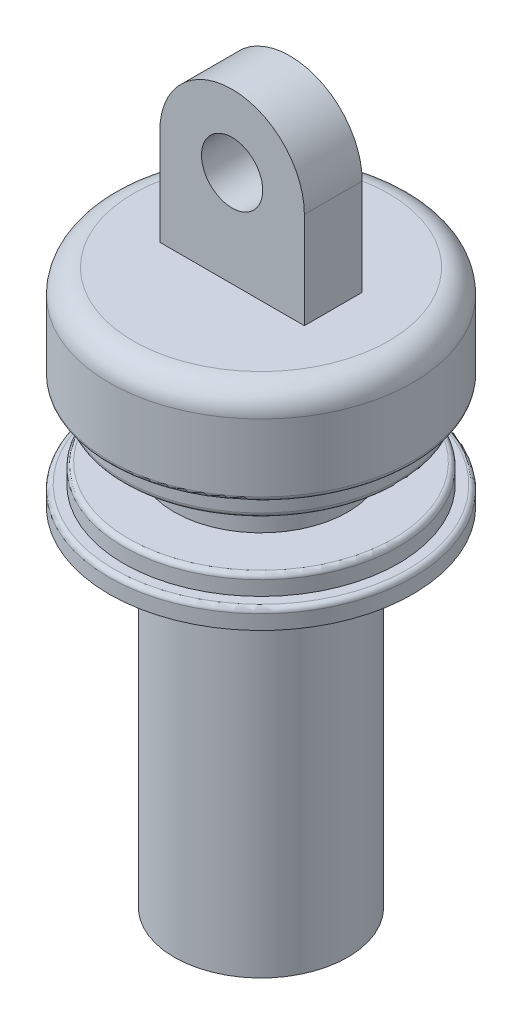
ISO-10303-21;
HEADER;
FILE_DESCRIPTION(('STEP AP214'),'2;1');
FILE_NAME('part.step','',(''),(''),'','','');
FILE_SCHEMA(('AUTOMOTIVE_DESIGN { 1 0 10303 214 1 1 1 1 }'));
ENDSEC;
DATA;
#1=APPLICATION_CONTEXT('core data for automotive mechanical design processes');
#2=APPLICATION_PROTOCOL_DEFINITION('international standard','automotive_design',2000,#1);
#3=PRODUCT_CONTEXT('',#1,'mechanical');
#4=PRODUCT('Part','Part','',(#3));
#5=PRODUCT_RELATED_PRODUCT_CATEGORY('part','',(#4));
#6=PRODUCT_DEFINITION_FORMATION('','',#4);
#7=PRODUCT_DEFINITION_CONTEXT('part definition',#1,'design');
#8=PRODUCT_DEFINITION('design','',#6,#7);
#9=PRODUCT_DEFINITION_SHAPE('','',#8);
#10=(LENGTH_UNIT() NAMED_UNIT(*) SI_UNIT(.MILLI.,.METRE.));
#11=(NAMED_UNIT(*) PLANE_ANGLE_UNIT() SI_UNIT($,.RADIAN.));
#12=(NAMED_UNIT(*) SI_UNIT($,.STERADIAN.) SOLID_ANGLE_UNIT());
#13=UNCERTAINTY_MEASURE_WITH_UNIT(LENGTH_MEASURE(1.E-05),#10,'distance_accuracy_value','');
#14=(GEOMETRIC_REPRESENTATION_CONTEXT(3) GLOBAL_UNCERTAINTY_ASSIGNED_CONTEXT((#13)) GLOBAL_UNIT_ASSIGNED_CONTEXT((#10,
#11,#12)) REPRESENTATION_CONTEXT('',''));
#15=CARTESIAN_POINT('',(0.,0.,0.));
#16=DIRECTION('',(0.,0.,1.));
#17=DIRECTION('',(1.,0.,0.));
#18=AXIS2_PLACEMENT_3D('',#15,#16,#17);
#19=CARTESIAN_POINT('',(0.,-135.,0.));
#20=DIRECTION('',(0.,1.,0.));
#21=DIRECTION('',(0.,0.,1.));
#22=AXIS2_PLACEMENT_3D('',#19,#20,#21);
#23=CYLINDRICAL_SURFACE('',#22,18.);
#24=CARTESIAN_POINT('',(0.,-55.,0.));
#25=DIRECTION('',(0.,1.,0.));
#26=DIRECTION('',(0.,0.,1.));
#27=AXIS2_PLACEMENT_3D('',#24,#25,#26);
#28=CIRCLE('',#27,18.);
#29=CARTESIAN_POINT('',(0.,-55.,18.));
#30=VERTEX_POINT('',#29);
#31=EDGE_CURVE('E467',#30,#30,#28,.T.);
#32=CARTESIAN_POINT('',(0.,-45.,0.));
#33=DIRECTION('',(0.,-1.,0.));
#34=DIRECTION('',(0.,0.,-1.));
#35=AXIS2_PLACEMENT_3D('',#32,#33,#34);
#36=CIRCLE('',#35,18.);
#37=CARTESIAN_POINT('',(0.,-45.,18.));
#38=VERTEX_POINT('',#37);
#39=EDGE_CURVE('E189',#38,#38,#36,.T.);
#40=CARTESIAN_POINT('',(0.,-55.,18.));
#41=CARTESIAN_POINT('',(0.,-54.8958333333333,18.));
#42=CARTESIAN_POINT('',(0.,-54.7916666666667,18.));
#43=CARTESIAN_POINT('',(0.,-54.5833333333333,18.));
#44=CARTESIAN_POINT('',(0.,-54.4791666666667,18.));
#45=CARTESIAN_POINT('',(0.,-54.2708333333333,18.));
#46=CARTESIAN_POINT('',(0.,-54.1666666666667,18.));
#47=CARTESIAN_POINT('',(0.,-53.9583333333333,18.));
#48=CARTESIAN_POINT('',(0.,-53.8541666666667,18.));
#49=CARTESIAN_POINT('',(0.,-53.6458333333333,18.));
#50=CARTESIAN_POINT('',(0.,-53.5416666666667,18.));
#51=CARTESIAN_POINT('',(0.,-53.3333333333333,18.));
#52=CARTESIAN_POINT('',(0.,-53.2291666666667,18.));
#53=CARTESIAN_POINT('',(0.,-53.0208333333333,18.));
#54=CARTESIAN_POINT('',(0.,-52.9166666666667,18.));
#55=CARTESIAN_POINT('',(0.,-52.7083333333333,18.));
#56=CARTESIAN_POINT('',(0.,-52.6041666666667,18.));
#57=CARTESIAN_POINT('',(0.,-52.3958333333333,18.));
#58=CARTESIAN_POINT('',(0.,-52.2916666666667,18.));
#59=CARTESIAN_POINT('',(0.,-52.0833333333333,18.));
#60=CARTESIAN_POINT('',(0.,-51.9791666666667,18.));
#61=CARTESIAN_POINT('',(0.,-51.7708333333333,18.));
#62=CARTESIAN_POINT('',(0.,-51.6666666666667,18.));
#63=CARTESIAN_POINT('',(0.,-51.4583333333333,18.));
#64=CARTESIAN_POINT('',(0.,-51.3541666666667,18.));
#65=CARTESIAN_POINT('',(0.,-51.1458333333333,18.));
#66=CARTESIAN_POINT('',(0.,-51.0416666666667,18.));
#67=CARTESIAN_POINT('',(0.,-50.8333333333333,18.));
#68=CARTESIAN_POINT('',(0.,-50.7291666666667,18.));
#69=CARTESIAN_POINT('',(0.,-50.5208333333333,18.));
#70=CARTESIAN_POINT('',(0.,-50.4166666666667,18.));
#71=CARTESIAN_POINT('',(0.,-50.2083333333333,18.));
#72=CARTESIAN_POINT('',(0.,-50.1041666666667,18.));
#73=CARTESIAN_POINT('',(0.,-49.8958333333333,18.));
#74=CARTESIAN_POINT('',(0.,-49.7916666666667,18.));
#75=CARTESIAN_POINT('',(0.,-49.5833333333333,18.));
#76=CARTESIAN_POINT('',(0.,-49.4791666666667,18.));
#77=CARTESIAN_POINT('',(0.,-49.2708333333333,18.));
#78=CARTESIAN_POINT('',(0.,-49.1666666666667,18.));
#79=CARTESIAN_POINT('',(0.,-48.9583333333333,18.));
#80=CARTESIAN_POINT('',(0.,-48.8541666666667,18.));
#81=CARTESIAN_POINT('',(0.,-48.6458333333333,18.));
#82=CARTESIAN_POINT('',(0.,-48.5416666666667,18.));
#83=CARTESIAN_POINT('',(0.,-48.3333333333333,18.));
#84=CARTESIAN_POINT('',(0.,-48.2291666666667,18.));
#85=CARTESIAN_POINT('',(0.,-48.0208333333333,18.));
#86=CARTESIAN_POINT('',(0.,-47.9166666666667,18.));
#87=CARTESIAN_POINT('',(0.,-47.7083333333333,18.));
#88=CARTESIAN_POINT('',(0.,-47.6041666666667,18.));
#89=CARTESIAN_POINT('',(0.,-47.3958333333333,18.));
#90=CARTESIAN_POINT('',(0.,-47.2916666666667,18.));
#91=CARTESIAN_POINT('',(0.,-47.0833333333333,18.));
#92=CARTESIAN_POINT('',(0.,-46.9791666666667,18.));
#93=CARTESIAN_POINT('',(0.,-46.7708333333333,18.));
#94=CARTESIAN_POINT('',(0.,-46.6666666666667,18.));
#95=CARTESIAN_POINT('',(0.,-46.4583333333333,18.));
#96=CARTESIAN_POINT('',(0.,-46.3541666666667,18.));
#97=CARTESIAN_POINT('',(0.,-46.1458333333333,18.));
#98=CARTESIAN_POINT('',(0.,-46.0416666666667,18.));
#99=CARTESIAN_POINT('',(0.,-45.8333333333333,18.));
#100=CARTESIAN_POINT('',(0.,-45.7291666666667,18.));
#101=CARTESIAN_POINT('',(0.,-45.5208333333333,18.));
#102=CARTESIAN_POINT('',(0.,-45.4166666666667,18.));
#103=CARTESIAN_POINT('',(0.,-45.2083333333333,18.));
#104=CARTESIAN_POINT('',(0.,-45.1041666666667,18.));
#105=CARTESIAN_POINT('',(0.,-45.,18.));
#106=B_SPLINE_CURVE_WITH_KNOTS('',3,(#40,#41,#42,#43,#44,#45,#46,#47,#48,#49,#50,#51,#52,#53,
#54,#55,#56,#57,#58,#59,#60,#61,#62,#63,#64,#65,#66,#67,#68,#69,#70,#71,#72,#73,#74,#75,#76,#77,
#78,#79,#80,#81,#82,#83,#84,#85,#86,#87,#88,#89,#90,#91,#92,#93,#94,#95,#96,#97,#98,#99,#100,
#101,#102,#103,#104,#105),.UNSPECIFIED.,.F.,.F.,(4,2,2,2,2,2,2,2,2,2,2,2,2,2,2,2,2,2,2,2,2,2,2,
2,2,2,2,2,2,2,2,2,4),(0.,0.312499999999993,0.625000000000001,0.937500000000008,1.25,
1.56249999999999,1.875,2.18750000000001,2.5,2.8125,3.125,3.43750000000001,3.75,4.0625,4.375,
4.68750000000001,5.,5.3125,5.62500000000001,5.93750000000001,6.25000000000001,6.5625,
6.87500000000001,7.18750000000001,7.50000000000001,7.8125,8.12500000000001,8.43750000000001,
8.75000000000001,9.0625,9.37500000000001,9.68750000000002,10.),.UNSPECIFIED.);
#107=EDGE_CURVE('BSEAM37',#30,#38,#106,.T.);
#108=ORIENTED_EDGE('',*,*,#31,.T.);
#109=ORIENTED_EDGE('',*,*,#39,.T.);
#110=ORIENTED_EDGE('',*,*,#107,.T.);
#111=ORIENTED_EDGE('',*,*,#107,.F.);
#112=EDGE_LOOP('',(#108,#110,#109,#111));
#113=FACE_BOUND('',#112,.T.);
#114=ADVANCED_FACE('F37',(#113),#23,.T.);
#115=CARTESIAN_POINT('',(0.,-45.,0.));
#116=DIRECTION('',(0.,-1.,0.));
#117=DIRECTION('',(0.,0.,-1.));
#118=AXIS2_PLACEMENT_3D('',#115,#116,#117);
#119=PLANE('',#118);
#120=CARTESIAN_POINT('',(0.,-45.,0.));
#121=DIRECTION('',(0.,-1.,0.));
#122=DIRECTION('',(0.,0.,-1.));
#123=AXIS2_PLACEMENT_3D('',#120,#121,#122);
#124=CIRCLE('',#123,27.5);
#125=CARTESIAN_POINT('',(0.,-45.,-27.5));
#126=VERTEX_POINT('',#125);
#127=EDGE_CURVE('E119',#126,#126,#124,.T.);
#128=ORIENTED_EDGE('',*,*,#127,.T.);
#129=EDGE_LOOP('',(#128));
#130=FACE_BOUND('',#129,.T.);
#131=ORIENTED_EDGE('',*,*,#39,.F.);
#132=EDGE_LOOP('',(#131));
#133=FACE_BOUND('',#132,.T.);
#134=ADVANCED_FACE('F160',(#130,#133),#119,.T.);
#135=CARTESIAN_POINT('',(0.,-40.,0.));
#136=DIRECTION('',(0.,-1.,0.));
#137=DIRECTION('',(0.,0.,-1.));
#138=AXIS2_PLACEMENT_3D('',#135,#136,#137);
#139=PLANE('',#138);
#140=CARTESIAN_POINT('',(0.,-40.,0.));
#141=DIRECTION('',(0.,-1.,0.));
#142=DIRECTION('',(0.,0.,-1.));
#143=AXIS2_PLACEMENT_3D('',#140,#141,#142);
#144=CIRCLE('',#143,29.5);
#145=CARTESIAN_POINT('',(0.,-40.,-29.5));
#146=VERTEX_POINT('',#145);
#147=EDGE_CURVE('E47',#146,#146,#144,.F.);
#148=ORIENTED_EDGE('',*,*,#147,.T.);
#149=EDGE_LOOP('',(#148));
#150=FACE_BOUND('',#149,.T.);
#151=CARTESIAN_POINT('',(0.,-40.,0.));
#152=DIRECTION('',(0.,-1.,0.));
#153=DIRECTION('',(0.,0.,-1.));
#154=AXIS2_PLACEMENT_3D('',#151,#152,#153);
#155=CIRCLE('',#154,30.5);
#156=CARTESIAN_POINT('',(0.,-40.,-30.5));
#157=VERTEX_POINT('',#156);
#158=EDGE_CURVE('E128',#157,#157,#155,.T.);
#159=ORIENTED_EDGE('',*,*,#158,.T.);
#160=EDGE_LOOP('',(#159));
#161=FACE_BOUND('',#160,.T.);
#162=ADVANCED_FACE('F134',(#150,#161),#139,.T.);
#163=CARTESIAN_POINT('',(-15.,-20.,6.));
#164=DIRECTION('',(1.,0.,0.));
#165=DIRECTION('',(0.,0.,-1.));
#166=AXIS2_PLACEMENT_3D('',#163,#164,#165);
#167=PLANE('',#166);
#168=DIRECTION('',(0.,-1.,0.));
#169=VECTOR('',#168,1.);
#170=CARTESIAN_POINT('',(-15.,-20.,-6.));
#171=LINE('',#170,#169);
#172=CARTESIAN_POINT('',(-15.,0.,-6.));
#173=VERTEX_POINT('',#172);
#174=CARTESIAN_POINT('',(-15.,-20.,-6.));
#175=VERTEX_POINT('',#174);
#176=EDGE_CURVE('E103',#173,#175,#171,.T.);
#177=ORIENTED_EDGE('',*,*,#176,.T.);
#178=DIRECTION('',(0.,0.,-1.));
#179=VECTOR('',#178,1.);
#180=CARTESIAN_POINT('',(-15.,-20.,6.));
#181=LINE('',#180,#179);
#182=CARTESIAN_POINT('',(-15.,-20.,6.));
#183=VERTEX_POINT('',#182);
#184=EDGE_CURVE('E98',#183,#175,#181,.T.);
#185=ORIENTED_EDGE('',*,*,#184,.F.);
#186=DIRECTION('',(0.,-1.,0.));
#187=VECTOR('',#186,1.);
#188=CARTESIAN_POINT('',(-15.,-20.,6.));
#189=LINE('',#188,#187);
#190=CARTESIAN_POINT('',(-15.,0.,6.));
#191=VERTEX_POINT('',#190);
#192=EDGE_CURVE('E81',#191,#183,#189,.T.);
#193=ORIENTED_EDGE('',*,*,#192,.F.);
#194=DIRECTION('',(0.,0.,-1.));
#195=VECTOR('',#194,1.);
#196=CARTESIAN_POINT('',(-15.,0.,6.));
#197=LINE('',#196,#195);
#198=EDGE_CURVE('E109',#191,#173,#197,.T.);
#199=ORIENTED_EDGE('',*,*,#198,.T.);
#200=EDGE_LOOP('',(#177,#185,#193,#199));
#201=FACE_BOUND('',#200,.T.);
#202=ADVANCED_FACE('F205',(#201),#167,.F.);
#203=CARTESIAN_POINT('',(15.,-20.,6.));
#204=DIRECTION('',(-1.,0.,0.));
#205=DIRECTION('',(0.,0.,1.));
#206=AXIS2_PLACEMENT_3D('',#203,#204,#205);
#207=PLANE('',#206);
#208=DIRECTION('',(0.,1.,0.));
#209=VECTOR('',#208,1.);
#210=CARTESIAN_POINT('',(15.,-20.,-6.));
#211=LINE('',#210,#209);
#212=CARTESIAN_POINT('',(15.,-20.,-6.));
#213=VERTEX_POINT('',#212);
#214=CARTESIAN_POINT('',(15.,0.,-6.));
#215=VERTEX_POINT('',#214);
#216=EDGE_CURVE('E70',#213,#215,#211,.T.);
#217=ORIENTED_EDGE('',*,*,#216,.T.);
#218=DIRECTION('',(0.,0.,-1.));
#219=VECTOR('',#218,1.);
#220=CARTESIAN_POINT('',(15.,0.,6.));
#221=LINE('',#220,#219);
#222=CARTESIAN_POINT('',(15.,0.,6.));
#223=VERTEX_POINT('',#222);
#224=EDGE_CURVE('E99',#223,#215,#221,.T.);
#225=ORIENTED_EDGE('',*,*,#224,.F.);
#226=DIRECTION('',(0.,1.,0.));
#227=VECTOR('',#226,1.);
#228=CARTESIAN_POINT('',(15.,-20.,6.));
#229=LINE('',#228,#227);
#230=CARTESIAN_POINT('',(15.,-20.,6.));
#231=VERTEX_POINT('',#230);
#232=EDGE_CURVE('E95',#231,#223,#229,.T.);
#233=ORIENTED_EDGE('',*,*,#232,.F.);
#234=DIRECTION('',(0.,0.,-1.));
#235=VECTOR('',#234,1.);
#236=CARTESIAN_POINT('',(15.,-20.,6.));
#237=LINE('',#236,#235);
#238=EDGE_CURVE('E93',#231,#213,#237,.T.);
#239=ORIENTED_EDGE('',*,*,#238,.T.);
#240=EDGE_LOOP('',(#217,#225,#233,#239));
#241=FACE_BOUND('',#240,.T.);
#242=ADVANCED_FACE('F94',(#241),#207,.F.);
#243=CARTESIAN_POINT('',(0.,0.,6.));
#244=DIRECTION('',(0.,0.,-1.));
#245=DIRECTION('',(-1.,0.,0.));
#246=AXIS2_PLACEMENT_3D('',#243,#244,#245);
#247=CYLINDRICAL_SURFACE('',#246,15.);
#248=CARTESIAN_POINT('',(0.,0.,-6.));
#249=DIRECTION('',(0.,0.,1.));
#250=DIRECTION('',(-1.,0.,0.));
#251=AXIS2_PLACEMENT_3D('',#248,#249,#250);
#252=CIRCLE('',#251,15.);
#253=EDGE_CURVE('E76',#215,#173,#252,.T.);
#254=ORIENTED_EDGE('',*,*,#253,.T.);
#255=ORIENTED_EDGE('',*,*,#198,.F.);
#256=CARTESIAN_POINT('',(0.,0.,6.));
#257=DIRECTION('',(0.,0.,1.));
#258=DIRECTION('',(-1.,0.,0.));
#259=AXIS2_PLACEMENT_3D('',#256,#257,#258);
#260=CIRCLE('',#259,15.);
#261=EDGE_CURVE('E55',#223,#191,#260,.T.);
#262=ORIENTED_EDGE('',*,*,#261,.F.);
#263=ORIENTED_EDGE('',*,*,#224,.T.);
#264=EDGE_LOOP('',(#254,#255,#262,#263));
#265=FACE_BOUND('',#264,.T.);
#266=ADVANCED_FACE('F203',(#265),#247,.T.);
#267=CARTESIAN_POINT('',(0.,0.,6.));
#268=DIRECTION('',(0.,0.,-1.));
#269=DIRECTION('',(-1.,0.,0.));
#270=AXIS2_PLACEMENT_3D('',#267,#268,#269);
#271=PLANE('',#270);
#272=CARTESIAN_POINT('',(0.,0.,6.));
#273=DIRECTION('',(0.,0.,1.));
#274=DIRECTION('',(1.,0.,0.));
#275=AXIS2_PLACEMENT_3D('',#272,#273,#274);
#276=CIRCLE('',#275,6.35);
#277=CARTESIAN_POINT('',(6.35,0.,6.));
#278=VERTEX_POINT('',#277);
#279=EDGE_CURVE('E188',#278,#278,#276,.T.);
#280=ORIENTED_EDGE('',*,*,#279,.F.);
#281=EDGE_LOOP('',(#280));
#282=FACE_BOUND('',#281,.T.);
#283=ORIENTED_EDGE('',*,*,#192,.T.);
#284=DIRECTION('',(1.,0.,0.));
#285=VECTOR('',#284,1.);
#286=CARTESIAN_POINT('',(-15.,-20.,6.));
#287=LINE('',#286,#285);
#288=EDGE_CURVE('E200',#183,#231,#287,.T.);
#289=ORIENTED_EDGE('',*,*,#288,.T.);
#290=ORIENTED_EDGE('',*,*,#232,.T.);
#291=ORIENTED_EDGE('',*,*,#261,.T.);
#292=EDGE_LOOP('',(#283,#289,#290,#291));
#293=FACE_BOUND('',#292,.T.);
#294=ADVANCED_FACE('F202',(#282,#293),#271,.F.);
#295=CARTESIAN_POINT('',(0.,0.,-6.));
#296=DIRECTION('',(0.,0.,-1.));
#297=DIRECTION('',(-1.,0.,0.));
#298=AXIS2_PLACEMENT_3D('',#295,#296,#297);
#299=PLANE('',#298);
#300=CARTESIAN_POINT('',(0.,0.,-6.));
#301=DIRECTION('',(0.,0.,-1.));
#302=DIRECTION('',(-1.,0.,0.));
#303=AXIS2_PLACEMENT_3D('',#300,#301,#302);
#304=CIRCLE('',#303,6.35);
#305=CARTESIAN_POINT('',(-6.35,0.,-6.));
#306=VERTEX_POINT('',#305);
#307=EDGE_CURVE('E41',#306,#306,#304,.T.);
#308=ORIENTED_EDGE('',*,*,#307,.F.);
#309=EDGE_LOOP('',(#308));
#310=FACE_BOUND('',#309,.T.);
#311=ORIENTED_EDGE('',*,*,#176,.F.);
#312=ORIENTED_EDGE('',*,*,#253,.F.);
#313=ORIENTED_EDGE('',*,*,#216,.F.);
#314=DIRECTION('',(1.,0.,0.));
#315=VECTOR('',#314,1.);
#316=CARTESIAN_POINT('',(-15.,-20.,-6.));
#317=LINE('',#316,#315);
#318=EDGE_CURVE('E88',#175,#213,#317,.T.);
#319=ORIENTED_EDGE('',*,*,#318,.F.);
#320=EDGE_LOOP('',(#311,#312,#313,#319));
#321=FACE_BOUND('',#320,.T.);
#322=ADVANCED_FACE('F86',(#310,#321),#299,.T.);
#323=CARTESIAN_POINT('',(0.,-20.,0.));
#324=DIRECTION('',(0.,-1.,0.));
#325=DIRECTION('',(0.,0.,-1.));
#326=AXIS2_PLACEMENT_3D('',#323,#324,#325);
#327=PLANE('',#326);
#328=CARTESIAN_POINT('',(0.,-20.,0.));
#329=DIRECTION('',(0.,-1.,0.));
#330=DIRECTION('',(0.,0.,-1.));
#331=AXIS2_PLACEMENT_3D('',#328,#329,#330);
#332=CIRCLE('',#331,26.5);
#333=CARTESIAN_POINT('',(0.,-20.,-26.5));
#334=VERTEX_POINT('',#333);
#335=EDGE_CURVE('E116',#334,#334,#332,.F.);
#336=ORIENTED_EDGE('',*,*,#335,.T.);
#337=EDGE_LOOP('',(#336));
#338=FACE_BOUND('',#337,.T.);
#339=ORIENTED_EDGE('',*,*,#238,.F.);
#340=ORIENTED_EDGE('',*,*,#288,.F.);
#341=ORIENTED_EDGE('',*,*,#184,.T.);
#342=ORIENTED_EDGE('',*,*,#318,.T.);
#343=EDGE_LOOP('',(#339,#340,#341,#342));
#344=FACE_BOUND('',#343,.T.);
#345=ADVANCED_FACE('F102',(#338,#344),#327,.F.);
#346=CARTESIAN_POINT('',(0.,-40.,0.));
#347=DIRECTION('',(0.,1.,0.));
#348=DIRECTION('',(0.,0.,1.));
#349=AXIS2_PLACEMENT_3D('',#346,#347,#348);
#350=CYLINDRICAL_SURFACE('',#349,31.5);
#351=CARTESIAN_POINT('',(0.,-39.,0.));
#352=DIRECTION('',(0.,-1.,0.));
#353=DIRECTION('',(0.,0.,-1.));
#354=AXIS2_PLACEMENT_3D('',#351,#352,#353);
#355=CIRCLE('',#354,31.5);
#356=CARTESIAN_POINT('',(0.,-39.,-31.5));
#357=VERTEX_POINT('',#356);
#358=EDGE_CURVE('E11',#357,#357,#355,.F.);
#359=ORIENTED_EDGE('',*,*,#358,.T.);
#360=EDGE_LOOP('',(#359));
#361=FACE_BOUND('',#360,.T.);
#362=CARTESIAN_POINT('',(0.,-25.,0.));
#363=DIRECTION('',(0.,-1.,0.));
#364=DIRECTION('',(0.,0.,-1.));
#365=AXIS2_PLACEMENT_3D('',#362,#363,#364);
#366=CIRCLE('',#365,31.5);
#367=CARTESIAN_POINT('',(0.,-25.,-31.5));
#368=VERTEX_POINT('',#367);
#369=EDGE_CURVE('E113',#368,#368,#366,.T.);
#370=ORIENTED_EDGE('',*,*,#369,.T.);
#371=EDGE_LOOP('',(#370));
#372=FACE_BOUND('',#371,.T.);
#373=ADVANCED_FACE('F146',(#361,#372),#350,.T.);
#374=CARTESIAN_POINT('',(0.,-45.,0.));
#375=DIRECTION('',(0.,1.,0.));
#376=DIRECTION('',(0.,0.,1.));
#377=AXIS2_PLACEMENT_3D('',#374,#375,#376);
#378=CYLINDRICAL_SURFACE('',#377,28.5);
#379=CARTESIAN_POINT('',(0.,-44.,0.));
#380=DIRECTION('',(0.,-1.,0.));
#381=DIRECTION('',(0.,0.,-1.));
#382=AXIS2_PLACEMENT_3D('',#379,#380,#381);
#383=CIRCLE('',#382,28.5);
#384=CARTESIAN_POINT('',(0.,-44.,-28.5));
#385=VERTEX_POINT('',#384);
#386=EDGE_CURVE('E125',#385,#385,#383,.F.);
#387=ORIENTED_EDGE('',*,*,#386,.T.);
#388=EDGE_LOOP('',(#387));
#389=FACE_BOUND('',#388,.T.);
#390=CARTESIAN_POINT('',(0.,-41.,0.));
#391=DIRECTION('',(0.,-1.,0.));
#392=DIRECTION('',(0.,0.,-1.));
#393=AXIS2_PLACEMENT_3D('',#390,#391,#392);
#394=CIRCLE('',#393,28.5);
#395=CARTESIAN_POINT('',(0.,-41.,-28.5));
#396=VERTEX_POINT('',#395);
#397=EDGE_CURVE('E122',#396,#396,#394,.T.);
#398=ORIENTED_EDGE('',*,*,#397,.T.);
#399=EDGE_LOOP('',(#398));
#400=FACE_BOUND('',#399,.T.);
#401=ADVANCED_FACE('F143',(#389,#400),#378,.T.);
#402=CARTESIAN_POINT('',(0.,-25.,0.));
#403=DIRECTION('',(0.,-1.,0.));
#404=DIRECTION('',(0.,0.,-1.));
#405=AXIS2_PLACEMENT_3D('',#402,#403,#404);
#406=TOROIDAL_SURFACE('',#405,26.5,5.);
#407=ORIENTED_EDGE('',*,*,#335,.F.);
#408=EDGE_LOOP('',(#407));
#409=FACE_BOUND('',#408,.T.);
#410=ORIENTED_EDGE('',*,*,#369,.F.);
#411=EDGE_LOOP('',(#410));
#412=FACE_BOUND('',#411,.T.);
#413=ADVANCED_FACE('F145',(#409,#412),#406,.T.);
#414=CARTESIAN_POINT('',(0.,-44.,0.));
#415=DIRECTION('',(0.,-1.,0.));
#416=DIRECTION('',(0.,0.,-1.));
#417=AXIS2_PLACEMENT_3D('',#414,#415,#416);
#418=TOROIDAL_SURFACE('',#417,27.5,1.);
#419=ORIENTED_EDGE('',*,*,#386,.F.);
#420=EDGE_LOOP('',(#419));
#421=FACE_BOUND('',#420,.T.);
#422=ORIENTED_EDGE('',*,*,#127,.F.);
#423=EDGE_LOOP('',(#422));
#424=FACE_BOUND('',#423,.T.);
#425=ADVANCED_FACE('F140',(#421,#424),#418,.T.);
#426=CARTESIAN_POINT('',(0.,-41.,0.));
#427=DIRECTION('',(0.,-1.,0.));
#428=DIRECTION('',(0.,0.,-1.));
#429=AXIS2_PLACEMENT_3D('',#426,#427,#428);
#430=TOROIDAL_SURFACE('',#429,29.5,1.);
#431=ORIENTED_EDGE('',*,*,#147,.F.);
#432=EDGE_LOOP('',(#431));
#433=FACE_BOUND('',#432,.T.);
#434=ORIENTED_EDGE('',*,*,#397,.F.);
#435=EDGE_LOOP('',(#434));
#436=FACE_BOUND('',#435,.T.);
#437=ADVANCED_FACE('F137',(#433,#436),#430,.F.);
#438=CARTESIAN_POINT('',(0.,-39.,0.));
#439=DIRECTION('',(0.,-1.,0.));
#440=DIRECTION('',(0.,0.,-1.));
#441=AXIS2_PLACEMENT_3D('',#438,#439,#440);
#442=TOROIDAL_SURFACE('',#441,30.5,1.);
#443=ORIENTED_EDGE('',*,*,#358,.F.);
#444=EDGE_LOOP('',(#443));
#445=FACE_BOUND('',#444,.T.);
#446=ORIENTED_EDGE('',*,*,#158,.F.);
#447=EDGE_LOOP('',(#446));
#448=FACE_BOUND('',#447,.T.);
#449=ADVANCED_FACE('F39',(#445,#448),#442,.T.);
#450=CARTESIAN_POINT('',(0.,0.,-7.));
#451=DIRECTION('',(0.,0.,1.));
#452=DIRECTION('',(1.,0.,0.));
#453=AXIS2_PLACEMENT_3D('',#450,#451,#452);
#454=CYLINDRICAL_SURFACE('',#453,6.35);
#455=ORIENTED_EDGE('',*,*,#307,.T.);
#456=EDGE_LOOP('',(#455));
#457=FACE_BOUND('',#456,.T.);
#458=ORIENTED_EDGE('',*,*,#279,.T.);
#459=EDGE_LOOP('',(#458));
#460=FACE_BOUND('',#459,.T.);
#461=ADVANCED_FACE('F236',(#457,#460),#454,.F.);
#462=CARTESIAN_POINT('',(-1.25693400999938E-13,-55.,-18.));
#463=DIRECTION('',(0.,1.,0.));
#464=DIRECTION('',(0.,0.,1.));
#465=AXIS2_PLACEMENT_3D('',#462,#463,#464);
#466=PLANE('',#465);
#467=CARTESIAN_POINT('',(0.,-55.,0.));
#468=DIRECTION('',(0.,1.,0.));
#469=DIRECTION('',(0.,0.,1.));
#470=AXIS2_PLACEMENT_3D('',#467,#468,#469);
#471=CIRCLE('',#470,27.5);
#472=CARTESIAN_POINT('',(0.,-55.,27.5));
#473=VERTEX_POINT('',#472);
#474=EDGE_CURVE('E469',#473,#473,#471,.T.);
#475=ORIENTED_EDGE('',*,*,#474,.T.);
#476=EDGE_LOOP('',(#475));
#477=FACE_BOUND('',#476,.T.);
#478=ORIENTED_EDGE('',*,*,#31,.F.);
#479=EDGE_LOOP('',(#478));
#480=FACE_BOUND('',#479,.T.);
#481=ADVANCED_FACE('F244',(#477,#480),#466,.T.);
#482=CARTESIAN_POINT('',(0.,-56.,0.));
#483=DIRECTION('',(0.,1.,0.));
#484=DIRECTION('',(0.,0.,1.));
#485=AXIS2_PLACEMENT_3D('',#482,#483,#484);
#486=TOROIDAL_SURFACE('',#485,27.5,1.);
#487=CARTESIAN_POINT('',(0.,-56.,0.));
#488=DIRECTION('',(0.,1.,0.));
#489=DIRECTION('',(0.,0.,1.));
#490=AXIS2_PLACEMENT_3D('',#487,#488,#489);
#491=CIRCLE('',#490,28.5);
#492=CARTESIAN_POINT('',(0.,-56.,28.5));
#493=VERTEX_POINT('',#492);
#494=EDGE_CURVE('E472',#493,#493,#491,.T.);
#495=ORIENTED_EDGE('',*,*,#494,.T.);
#496=EDGE_LOOP('',(#495));
#497=FACE_BOUND('',#496,.T.);
#498=ORIENTED_EDGE('',*,*,#474,.F.);
#499=EDGE_LOOP('',(#498));
#500=FACE_BOUND('',#499,.T.);
#501=ADVANCED_FACE('F253',(#497,#500),#486,.T.);
#502=CARTESIAN_POINT('',(0.,-49.5667376348425,0.));
#503=DIRECTION('',(0.,1.,0.));
#504=DIRECTION('',(0.,0.,1.));
#505=AXIS2_PLACEMENT_3D('',#502,#503,#504);
#506=CYLINDRICAL_SURFACE('',#505,28.5);
#507=CARTESIAN_POINT('',(0.,-59.,0.));
#508=DIRECTION('',(0.,1.,0.));
#509=DIRECTION('',(0.,0.,1.));
#510=AXIS2_PLACEMENT_3D('',#507,#508,#509);
#511=CIRCLE('',#510,28.5);
#512=CARTESIAN_POINT('',(0.,-59.,28.5));
#513=VERTEX_POINT('',#512);
#514=EDGE_CURVE('E475',#513,#513,#511,.T.);
#515=ORIENTED_EDGE('',*,*,#514,.T.);
#516=EDGE_LOOP('',(#515));
#517=FACE_BOUND('',#516,.T.);
#518=ORIENTED_EDGE('',*,*,#494,.F.);
#519=EDGE_LOOP('',(#518));
#520=FACE_BOUND('',#519,.T.);
#521=ADVANCED_FACE('F261',(#517,#520),#506,.T.);
#522=CARTESIAN_POINT('',(-1.99014551583235E-13,-59.,-28.5));
#523=DIRECTION('',(0.,1.,0.));
#524=DIRECTION('',(0.,0.,1.));
#525=AXIS2_PLACEMENT_3D('',#522,#523,#524);
#526=PLANE('',#525);
#527=CARTESIAN_POINT('',(0.,-59.,0.));
#528=DIRECTION('',(0.,1.,0.));
#529=DIRECTION('',(0.,0.,1.));
#530=AXIS2_PLACEMENT_3D('',#527,#528,#529);
#531=CIRCLE('',#530,30.5);
#532=CARTESIAN_POINT('',(0.,-59.,30.5));
#533=VERTEX_POINT('',#532);
#534=EDGE_CURVE('E478',#533,#533,#531,.T.);
#535=ORIENTED_EDGE('',*,*,#534,.T.);
#536=EDGE_LOOP('',(#535));
#537=FACE_BOUND('',#536,.T.);
#538=ORIENTED_EDGE('',*,*,#514,.F.);
#539=EDGE_LOOP('',(#538));
#540=FACE_BOUND('',#539,.T.);
#541=ADVANCED_FACE('F269',(#537,#540),#526,.T.);
#542=CARTESIAN_POINT('',(0.,-60.,0.));
#543=DIRECTION('',(0.,1.,0.));
#544=DIRECTION('',(0.,0.,1.));
#545=AXIS2_PLACEMENT_3D('',#542,#543,#544);
#546=TOROIDAL_SURFACE('',#545,30.5,1.);
#547=CARTESIAN_POINT('',(0.,-60.,0.));
#548=DIRECTION('',(0.,1.,0.));
#549=DIRECTION('',(0.,0.,1.));
#550=AXIS2_PLACEMENT_3D('',#547,#548,#549);
#551=CIRCLE('',#550,31.5);
#552=CARTESIAN_POINT('',(0.,-60.,31.5));
#553=VERTEX_POINT('',#552);
#554=EDGE_CURVE('E481',#553,#553,#551,.T.);
#555=ORIENTED_EDGE('',*,*,#554,.T.);
#556=EDGE_LOOP('',(#555));
#557=FACE_BOUND('',#556,.T.);
#558=ORIENTED_EDGE('',*,*,#534,.F.);
#559=EDGE_LOOP('',(#558));
#560=FACE_BOUND('',#559,.T.);
#561=ADVANCED_FACE('F277',(#557,#560),#546,.T.);
#562=CARTESIAN_POINT('',(0.,-49.5667376348425,0.));
#563=DIRECTION('',(0.,1.,0.));
#564=DIRECTION('',(0.,0.,1.));
#565=AXIS2_PLACEMENT_3D('',#562,#563,#564);
#566=CYLINDRICAL_SURFACE('',#565,31.5);
#567=CARTESIAN_POINT('',(0.,-63.,0.));
#568=DIRECTION('',(0.,1.,0.));
#569=DIRECTION('',(0.,0.,1.));
#570=AXIS2_PLACEMENT_3D('',#567,#568,#569);
#571=CIRCLE('',#570,31.5);
#572=CARTESIAN_POINT('',(0.,-63.,31.5));
#573=VERTEX_POINT('',#572);
#574=EDGE_CURVE('E484',#573,#573,#571,.T.);
#575=ORIENTED_EDGE('',*,*,#574,.T.);
#576=EDGE_LOOP('',(#575));
#577=FACE_BOUND('',#576,.T.);
#578=ORIENTED_EDGE('',*,*,#554,.F.);
#579=EDGE_LOOP('',(#578));
#580=FACE_BOUND('',#579,.T.);
#581=ADVANCED_FACE('F285',(#577,#580),#566,.T.);
#582=CARTESIAN_POINT('',(-2.19963451749891E-13,-63.,-31.5));
#583=DIRECTION('',(0.,-1.,0.));
#584=DIRECTION('',(0.,0.,-1.));
#585=AXIS2_PLACEMENT_3D('',#582,#583,#584);
#586=PLANE('',#585);
#587=CARTESIAN_POINT('',(0.,-63.,0.));
#588=DIRECTION('',(0.,1.,0.));
#589=DIRECTION('',(0.,0.,1.));
#590=AXIS2_PLACEMENT_3D('',#587,#588,#589);
#591=CIRCLE('',#590,18.);
#592=CARTESIAN_POINT('',(0.,-63.,18.));
#593=VERTEX_POINT('',#592);
#594=EDGE_CURVE('E183',#593,#593,#591,.T.);
#595=ORIENTED_EDGE('',*,*,#594,.T.);
#596=EDGE_LOOP('',(#595));
#597=FACE_BOUND('',#596,.T.);
#598=ORIENTED_EDGE('',*,*,#574,.F.);
#599=EDGE_LOOP('',(#598));
#600=FACE_BOUND('',#599,.T.);
#601=ADVANCED_FACE('F293',(#597,#600),#586,.T.);
#602=CARTESIAN_POINT('',(0.,-49.,-13.));
#603=DIRECTION('',(0.,1.,0.));
#604=DIRECTION('',(0.,0.,1.));
#605=AXIS2_PLACEMENT_3D('',#602,#603,#604);
#606=PLANE('',#605);
#607=CARTESIAN_POINT('',(0.,-49.,0.));
#608=DIRECTION('',(0.,1.,0.));
#609=DIRECTION('',(0.,0.,1.));
#610=AXIS2_PLACEMENT_3D('',#607,#608,#609);
#611=CIRCLE('',#610,13.);
#612=CARTESIAN_POINT('',(0.,-49.,13.));
#613=VERTEX_POINT('',#612);
#614=EDGE_CURVE('E462',#613,#613,#611,.T.);
#615=ORIENTED_EDGE('',*,*,#614,.F.);
#616=EDGE_LOOP('',(#615));
#617=FACE_BOUND('',#616,.T.);
#618=ADVANCED_FACE('F301',(#617),#606,.F.);
#619=CARTESIAN_POINT('',(0.,0.,0.));
#620=DIRECTION('',(0.,1.,0.));
#621=DIRECTION('',(0.,0.,1.));
#622=AXIS2_PLACEMENT_3D('',#619,#620,#621);
#623=CYLINDRICAL_SURFACE('',#622,13.);
#624=CARTESIAN_POINT('',(0.,-130.,0.));
#625=DIRECTION('',(0.,1.,0.));
#626=DIRECTION('',(0.,0.,1.));
#627=AXIS2_PLACEMENT_3D('',#624,#625,#626);
#628=CIRCLE('',#627,13.);
#629=CARTESIAN_POINT('',(0.,-130.,13.));
#630=VERTEX_POINT('',#629);
#631=EDGE_CURVE('E460',#630,#630,#628,.T.);
#632=ORIENTED_EDGE('',*,*,#631,.F.);
#633=EDGE_LOOP('',(#632));
#634=FACE_BOUND('',#633,.T.);
#635=ORIENTED_EDGE('',*,*,#614,.T.);
#636=EDGE_LOOP('',(#635));
#637=FACE_BOUND('',#636,.T.);
#638=ADVANCED_FACE('F309',(#634,#637),#623,.F.);
#639=CARTESIAN_POINT('',(0.,-130.,-6.));
#640=DIRECTION('',(0.,-1.,0.));
#641=DIRECTION('',(0.,0.,-1.));
#642=AXIS2_PLACEMENT_3D('',#639,#640,#641);
#643=PLANE('',#642);
#644=CARTESIAN_POINT('',(0.,-130.,0.));
#645=DIRECTION('',(0.,1.,0.));
#646=DIRECTION('',(0.,0.,1.));
#647=AXIS2_PLACEMENT_3D('',#644,#645,#646);
#648=CIRCLE('',#647,6.);
#649=CARTESIAN_POINT('',(0.,-130.,6.));
#650=VERTEX_POINT('',#649);
#651=EDGE_CURVE('E459',#650,#650,#648,.T.);
#652=ORIENTED_EDGE('',*,*,#651,.F.);
#653=EDGE_LOOP('',(#652));
#654=FACE_BOUND('',#653,.T.);
#655=ORIENTED_EDGE('',*,*,#631,.T.);
#656=EDGE_LOOP('',(#655));
#657=FACE_BOUND('',#656,.T.);
#658=ADVANCED_FACE('F317',(#654,#657),#643,.F.);
#659=CARTESIAN_POINT('',(0.,0.,0.));
#660=DIRECTION('',(0.,1.,0.));
#661=DIRECTION('',(0.,0.,1.));
#662=AXIS2_PLACEMENT_3D('',#659,#660,#661);
#663=CYLINDRICAL_SURFACE('',#662,6.);
#664=CARTESIAN_POINT('',(0.,-135.,0.));
#665=DIRECTION('',(0.,1.,0.));
#666=DIRECTION('',(0.,0.,1.));
#667=AXIS2_PLACEMENT_3D('',#664,#665,#666);
#668=CIRCLE('',#667,6.);
#669=CARTESIAN_POINT('',(0.,-135.,6.));
#670=VERTEX_POINT('',#669);
#671=EDGE_CURVE('E194',#670,#670,#668,.T.);
#672=ORIENTED_EDGE('',*,*,#671,.F.);
#673=EDGE_LOOP('',(#672));
#674=FACE_BOUND('',#673,.T.);
#675=ORIENTED_EDGE('',*,*,#651,.T.);
#676=EDGE_LOOP('',(#675));
#677=FACE_BOUND('',#676,.T.);
#678=ADVANCED_FACE('F178',(#674,#677),#663,.F.);
#679=CARTESIAN_POINT('',(0.,-135.,0.));
#680=DIRECTION('',(0.,-1.,0.));
#681=DIRECTION('',(0.,0.,-1.));
#682=AXIS2_PLACEMENT_3D('',#679,#680,#681);
#683=PLANE('',#682);
#684=ORIENTED_EDGE('',*,*,#671,.T.);
#685=EDGE_LOOP('',(#684));
#686=FACE_BOUND('',#685,.T.);
#687=CARTESIAN_POINT('',(0.,-135.,0.));
#688=DIRECTION('',(0.,-1.,0.));
#689=DIRECTION('',(0.,0.,-1.));
#690=AXIS2_PLACEMENT_3D('',#687,#688,#689);
#691=CIRCLE('',#690,18.);
#692=CARTESIAN_POINT('',(0.,-135.,18.));
#693=VERTEX_POINT('',#692);
#694=EDGE_CURVE('E186',#693,#693,#691,.T.);
#695=ORIENTED_EDGE('',*,*,#694,.T.);
#696=EDGE_LOOP('',(#695));
#697=FACE_BOUND('',#696,.T.);
#698=ADVANCED_FACE('F173',(#686,#697),#683,.T.);
#699=CARTESIAN_POINT('',(0.,-63.,18.));
#700=CARTESIAN_POINT('',(0.,-63.75,18.));
#701=CARTESIAN_POINT('',(0.,-64.5,18.));
#702=CARTESIAN_POINT('',(0.,-66.,18.));
#703=CARTESIAN_POINT('',(0.,-66.75,18.));
#704=CARTESIAN_POINT('',(0.,-68.25,18.));
#705=CARTESIAN_POINT('',(0.,-69.,18.));
#706=CARTESIAN_POINT('',(0.,-70.5,18.));
#707=CARTESIAN_POINT('',(0.,-71.25,18.));
#708=CARTESIAN_POINT('',(0.,-72.75,18.));
#709=CARTESIAN_POINT('',(0.,-73.5,18.));
#710=CARTESIAN_POINT('',(0.,-75.,18.));
#711=CARTESIAN_POINT('',(0.,-75.75,18.));
#712=CARTESIAN_POINT('',(0.,-77.25,18.));
#713=CARTESIAN_POINT('',(0.,-78.,18.));
#714=CARTESIAN_POINT('',(0.,-79.5,18.));
#715=CARTESIAN_POINT('',(0.,-80.25,18.));
#716=CARTESIAN_POINT('',(0.,-81.75,18.));
#717=CARTESIAN_POINT('',(0.,-82.5,18.));
#718=CARTESIAN_POINT('',(0.,-84.,18.));
#719=CARTESIAN_POINT('',(0.,-84.75,18.));
#720=CARTESIAN_POINT('',(0.,-86.25,18.));
#721=CARTESIAN_POINT('',(0.,-87.,18.));
#722=CARTESIAN_POINT('',(0.,-88.5,18.));
#723=CARTESIAN_POINT('',(0.,-89.25,18.));
#724=CARTESIAN_POINT('',(0.,-90.75,18.));
#725=CARTESIAN_POINT('',(0.,-91.5,18.));
#726=CARTESIAN_POINT('',(0.,-93.,18.));
#727=CARTESIAN_POINT('',(0.,-93.75,18.));
#728=CARTESIAN_POINT('',(0.,-95.25,18.));
#729=CARTESIAN_POINT('',(0.,-96.,18.));
#730=CARTESIAN_POINT('',(0.,-97.5,18.));
#731=CARTESIAN_POINT('',(0.,-98.25,18.));
#732=CARTESIAN_POINT('',(0.,-99.75,18.));
#733=CARTESIAN_POINT('',(0.,-100.5,18.));
#734=CARTESIAN_POINT('',(0.,-102.,18.));
#735=CARTESIAN_POINT('',(0.,-102.75,18.));
#736=CARTESIAN_POINT('',(0.,-104.25,18.));
#737=CARTESIAN_POINT('',(0.,-105.,18.));
#738=CARTESIAN_POINT('',(0.,-106.5,18.));
#739=CARTESIAN_POINT('',(0.,-107.25,18.));
#740=CARTESIAN_POINT('',(0.,-108.75,18.));
#741=CARTESIAN_POINT('',(0.,-109.5,18.));
#742=CARTESIAN_POINT('',(0.,-111.,18.));
#743=CARTESIAN_POINT('',(0.,-111.75,18.));
#744=CARTESIAN_POINT('',(0.,-113.25,18.));
#745=CARTESIAN_POINT('',(0.,-114.,18.));
#746=CARTESIAN_POINT('',(0.,-115.5,18.));
#747=CARTESIAN_POINT('',(0.,-116.25,18.));
#748=CARTESIAN_POINT('',(0.,-117.75,18.));
#749=CARTESIAN_POINT('',(0.,-118.5,18.));
#750=CARTESIAN_POINT('',(0.,-120.,18.));
#751=CARTESIAN_POINT('',(0.,-120.75,18.));
#752=CARTESIAN_POINT('',(0.,-122.25,18.));
#753=CARTESIAN_POINT('',(0.,-123.,18.));
#754=CARTESIAN_POINT('',(0.,-124.5,18.));
#755=CARTESIAN_POINT('',(0.,-125.25,18.));
#756=CARTESIAN_POINT('',(0.,-126.75,18.));
#757=CARTESIAN_POINT('',(0.,-127.5,18.));
#758=CARTESIAN_POINT('',(0.,-129.,18.));
#759=CARTESIAN_POINT('',(0.,-129.75,18.));
#760=CARTESIAN_POINT('',(0.,-131.25,18.));
#761=CARTESIAN_POINT('',(0.,-132.,18.));
#762=CARTESIAN_POINT('',(0.,-133.5,18.));
#763=CARTESIAN_POINT('',(0.,-134.25,18.));
#764=CARTESIAN_POINT('',(0.,-135.,18.));
#765=B_SPLINE_CURVE_WITH_KNOTS('',3,(#699,#700,#701,#702,#703,#704,#705,#706,#707,#708,#709,
#710,#711,#712,#713,#714,#715,#716,#717,#718,#719,#720,#721,#722,#723,#724,#725,#726,#727,#728,
#729,#730,#731,#732,#733,#734,#735,#736,#737,#738,#739,#740,#741,#742,#743,#744,#745,#746,#747,
#748,#749,#750,#751,#752,#753,#754,#755,#756,#757,#758,#759,#760,#761,#762,#763,#764),
.UNSPECIFIED.,.F.,.F.,(4,2,2,2,2,2,2,2,2,2,2,2,2,2,2,2,2,2,2,2,2,2,2,2,2,2,2,2,2,2,2,2,4),(0.,
2.25,4.5,6.75000000000001,8.99999999999999,11.25,13.5,15.75,18.,20.25,22.5,24.75,27.,29.25,31.5,
33.75,36.,38.25,40.5,42.75,45.,47.25,49.5,51.75,54.,56.25,58.5,60.75,63.,65.25,67.5,69.75,72.),.UNSPECIFIED.);
#766=EDGE_CURVE('BSEAM163',#593,#693,#765,.T.);
#767=ORIENTED_EDGE('',*,*,#594,.F.);
#768=ORIENTED_EDGE('',*,*,#694,.F.);
#769=ORIENTED_EDGE('',*,*,#766,.T.);
#770=ORIENTED_EDGE('',*,*,#766,.F.);
#771=EDGE_LOOP('',(#767,#769,#768,#770));
#772=FACE_BOUND('',#771,.T.);
#773=ADVANCED_FACE('F163',(#772),#23,.T.);
#774=CLOSED_SHELL('',(#114,#134,#162,#202,#242,#266,#294,#322,#345,#373,#401,#413,#425,#437,
#449,#461,#481,#501,#521,#541,#561,#581,#601,#618,#638,#658,#678,#698,#773));
#775=MANIFOLD_SOLID_BREP('B2',#774);
#776=ADVANCED_BREP_SHAPE_REPRESENTATION('',(#18,#775),#14);
#777=SHAPE_DEFINITION_REPRESENTATION(#9,#776);
ENDSEC;
END-ISO-10303-21;
